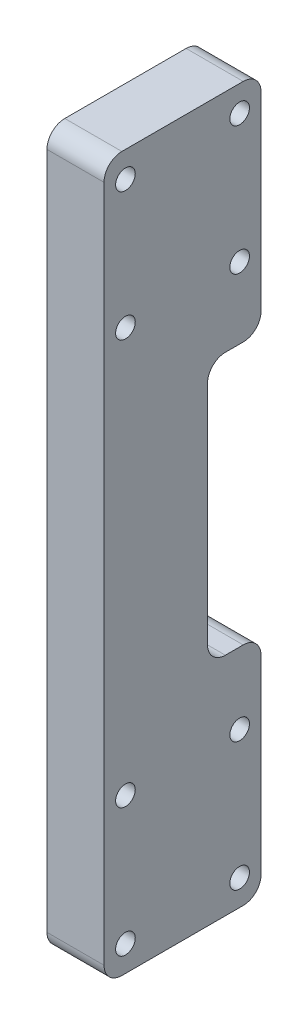
ISO-10303-21;
HEADER;
FILE_DESCRIPTION(('STEP AP214'),'2;1');
FILE_NAME('part.step','',(''),(''),'','','');
FILE_SCHEMA(('AUTOMOTIVE_DESIGN { 1 0 10303 214 1 1 1 1 }'));
ENDSEC;
DATA;
#1=APPLICATION_CONTEXT('core data for automotive mechanical design processes');
#2=APPLICATION_PROTOCOL_DEFINITION('international standard','automotive_design',2000,#1);
#3=PRODUCT_CONTEXT('',#1,'mechanical');
#4=PRODUCT('Part','Part','',(#3));
#5=PRODUCT_RELATED_PRODUCT_CATEGORY('part','',(#4));
#6=PRODUCT_DEFINITION_FORMATION('','',#4);
#7=PRODUCT_DEFINITION_CONTEXT('part definition',#1,'design');
#8=PRODUCT_DEFINITION('design','',#6,#7);
#9=PRODUCT_DEFINITION_SHAPE('','',#8);
#10=(LENGTH_UNIT() NAMED_UNIT(*) SI_UNIT(.MILLI.,.METRE.));
#11=(NAMED_UNIT(*) PLANE_ANGLE_UNIT() SI_UNIT($,.RADIAN.));
#12=(NAMED_UNIT(*) SI_UNIT($,.STERADIAN.) SOLID_ANGLE_UNIT());
#13=UNCERTAINTY_MEASURE_WITH_UNIT(LENGTH_MEASURE(1.E-05),#10,'distance_accuracy_value','');
#14=(GEOMETRIC_REPRESENTATION_CONTEXT(3) GLOBAL_UNCERTAINTY_ASSIGNED_CONTEXT((#13)) GLOBAL_UNIT_ASSIGNED_CONTEXT((#10,
#11,#12)) REPRESENTATION_CONTEXT('',''));
#15=CARTESIAN_POINT('',(0.,0.,0.));
#16=DIRECTION('',(0.,0.,1.));
#17=DIRECTION('',(1.,0.,0.));
#18=AXIS2_PLACEMENT_3D('',#15,#16,#17);
#19=CARTESIAN_POINT('',(16.,-123.946406973508,-52.6620779857653));
#20=DIRECTION('',(1.,0.,0.));
#21=DIRECTION('',(0.,1.,0.));
#22=AXIS2_PLACEMENT_3D('',#19,#20,#21);
#23=PLANE('',#22);
#24=CARTESIAN_POINT('',(16.0000000000006,-216.69640697351,-36.6620779857653));
#25=DIRECTION('',(-1.,0.,0.));
#26=DIRECTION('',(0.,1.,0.));
#27=AXIS2_PLACEMENT_3D('',#24,#25,#26);
#28=CIRCLE('',#27,2.75);
#29=CARTESIAN_POINT('',(16.0000000000006,-219.44640697351,-36.6620779857653));
#30=VERTEX_POINT('',#29);
#31=EDGE_CURVE('E289',#30,#30,#28,.T.);
#32=ORIENTED_EDGE('',*,*,#31,.T.);
#33=EDGE_LOOP('',(#32));
#34=FACE_BOUND('',#33,.T.);
#35=CARTESIAN_POINT('',(16.0000000000006,-216.69640697351,-68.6620779857653));
#36=DIRECTION('',(-1.,0.,0.));
#37=DIRECTION('',(0.,1.,0.));
#38=AXIS2_PLACEMENT_3D('',#35,#36,#37);
#39=CIRCLE('',#38,2.75);
#40=CARTESIAN_POINT('',(16.0000000000007,-219.44640697351,-68.6620779857653));
#41=VERTEX_POINT('',#40);
#42=EDGE_CURVE('E309',#41,#41,#39,.T.);
#43=ORIENTED_EDGE('',*,*,#42,.T.);
#44=EDGE_LOOP('',(#43));
#45=FACE_BOUND('',#44,.T.);
#46=CARTESIAN_POINT('',(16.0000000000004,-180.69640697351,-36.6620779857653));
#47=DIRECTION('',(-1.,0.,0.));
#48=DIRECTION('',(0.,1.,0.));
#49=AXIS2_PLACEMENT_3D('',#46,#47,#48);
#50=CIRCLE('',#49,2.75);
#51=CARTESIAN_POINT('',(16.0000000000004,-183.44640697351,-36.6620779857653));
#52=VERTEX_POINT('',#51);
#53=EDGE_CURVE('E304',#52,#52,#50,.T.);
#54=ORIENTED_EDGE('',*,*,#53,.T.);
#55=EDGE_LOOP('',(#54));
#56=FACE_BOUND('',#55,.T.);
#57=CARTESIAN_POINT('',(16.0000000000004,-180.69640697351,-68.6620779857653));
#58=DIRECTION('',(-1.,0.,0.));
#59=DIRECTION('',(0.,1.,0.));
#60=AXIS2_PLACEMENT_3D('',#57,#58,#59);
#61=CIRCLE('',#60,2.75);
#62=CARTESIAN_POINT('',(16.0000000000004,-183.44640697351,-68.6620779857653));
#63=VERTEX_POINT('',#62);
#64=EDGE_CURVE('E302',#63,#63,#61,.T.);
#65=ORIENTED_EDGE('',*,*,#64,.T.);
#66=EDGE_LOOP('',(#65));
#67=FACE_BOUND('',#66,.T.);
#68=CARTESIAN_POINT('',(15.9999999999996,-67.1964069735096,-36.6620779857653));
#69=DIRECTION('',(-1.,0.,0.));
#70=DIRECTION('',(0.,1.,0.));
#71=AXIS2_PLACEMENT_3D('',#68,#69,#70);
#72=CIRCLE('',#71,2.75);
#73=CARTESIAN_POINT('',(15.9999999999996,-69.9464069735096,-36.6620779857653));
#74=VERTEX_POINT('',#73);
#75=EDGE_CURVE('E298',#74,#74,#72,.T.);
#76=ORIENTED_EDGE('',*,*,#75,.T.);
#77=EDGE_LOOP('',(#76));
#78=FACE_BOUND('',#77,.T.);
#79=CARTESIAN_POINT('',(15.9999999999996,-67.1964069735096,-68.6620779857653));
#80=DIRECTION('',(-1.,0.,0.));
#81=DIRECTION('',(0.,1.,0.));
#82=AXIS2_PLACEMENT_3D('',#79,#80,#81);
#83=CIRCLE('',#82,2.75);
#84=CARTESIAN_POINT('',(15.9999999999997,-69.9464069735096,-68.6620779857653));
#85=VERTEX_POINT('',#84);
#86=EDGE_CURVE('E287',#85,#85,#83,.T.);
#87=ORIENTED_EDGE('',*,*,#86,.T.);
#88=EDGE_LOOP('',(#87));
#89=FACE_BOUND('',#88,.T.);
#90=CARTESIAN_POINT('',(15.9999999999994,-31.1964069735096,-36.6620779857653));
#91=DIRECTION('',(-1.,0.,0.));
#92=DIRECTION('',(0.,1.,0.));
#93=AXIS2_PLACEMENT_3D('',#90,#91,#92);
#94=CIRCLE('',#93,2.75);
#95=CARTESIAN_POINT('',(15.9999999999994,-33.9464069735096,-36.6620779857653));
#96=VERTEX_POINT('',#95);
#97=EDGE_CURVE('E282',#96,#96,#94,.T.);
#98=ORIENTED_EDGE('',*,*,#97,.T.);
#99=EDGE_LOOP('',(#98));
#100=FACE_BOUND('',#99,.T.);
#101=CARTESIAN_POINT('',(15.9999999999994,-31.1964069735096,-68.6620779857653));
#102=DIRECTION('',(-1.,0.,0.));
#103=DIRECTION('',(0.,1.,0.));
#104=AXIS2_PLACEMENT_3D('',#101,#102,#103);
#105=CIRCLE('',#104,2.75);
#106=CARTESIAN_POINT('',(15.9999999999994,-33.9464069735096,-68.6620779857653));
#107=VERTEX_POINT('',#106);
#108=EDGE_CURVE('E228',#107,#107,#105,.T.);
#109=ORIENTED_EDGE('',*,*,#108,.T.);
#110=EDGE_LOOP('',(#109));
#111=FACE_BOUND('',#110,.T.);
#112=CARTESIAN_POINT('',(16.,-28.9464069735079,-35.6620779857653));
#113=DIRECTION('',(-1.,0.,0.));
#114=DIRECTION('',(0.,0.707106781186548,0.707106781186548));
#115=AXIS2_PLACEMENT_3D('',#112,#113,#114);
#116=CIRCLE('',#115,5.);
#117=CARTESIAN_POINT('',(16.,-28.9464069735079,-30.6620779857653));
#118=VERTEX_POINT('',#117);
#119=CARTESIAN_POINT('',(16.,-23.9464069735079,-35.6620779857653));
#120=VERTEX_POINT('',#119);
#121=EDGE_CURVE('E499',#118,#120,#116,.T.);
#122=ORIENTED_EDGE('',*,*,#121,.F.);
#123=DIRECTION('',(0.,-1.,0.));
#124=VECTOR('',#123,1.);
#125=CARTESIAN_POINT('',(16.,-223.946406973508,-30.6620779857653));
#126=LINE('',#125,#124);
#127=CARTESIAN_POINT('',(16.,-218.946406973508,-30.6620779857653));
#128=VERTEX_POINT('',#127);
#129=EDGE_CURVE('E463',#118,#128,#126,.T.);
#130=ORIENTED_EDGE('',*,*,#129,.T.);
#131=CARTESIAN_POINT('',(16.,-218.946406973508,-35.6620779857653));
#132=DIRECTION('',(-1.,0.,0.));
#133=DIRECTION('',(0.,-0.707106781186548,0.707106781186548));
#134=AXIS2_PLACEMENT_3D('',#131,#132,#133);
#135=CIRCLE('',#134,5.);
#136=CARTESIAN_POINT('',(16.,-223.946406973508,-35.6620779857653));
#137=VERTEX_POINT('',#136);
#138=EDGE_CURVE('E271',#137,#128,#135,.T.);
#139=ORIENTED_EDGE('',*,*,#138,.F.);
#140=DIRECTION('',(0.,0.,-1.));
#141=VECTOR('',#140,1.);
#142=CARTESIAN_POINT('',(16.,-223.946406973508,-74.6620779857653));
#143=LINE('',#142,#141);
#144=CARTESIAN_POINT('',(16.,-223.946406973508,-69.6620779857653));
#145=VERTEX_POINT('',#144);
#146=EDGE_CURVE('E262',#137,#145,#143,.T.);
#147=ORIENTED_EDGE('',*,*,#146,.T.);
#148=CARTESIAN_POINT('',(16.,-218.946406973508,-69.6620779857653));
#149=DIRECTION('',(-1.,0.,0.));
#150=DIRECTION('',(0.,-0.707106781186548,-0.707106781186548));
#151=AXIS2_PLACEMENT_3D('',#148,#149,#150);
#152=CIRCLE('',#151,5.);
#153=CARTESIAN_POINT('',(16.,-218.946406973508,-74.6620779857653));
#154=VERTEX_POINT('',#153);
#155=EDGE_CURVE('E223',#154,#145,#152,.T.);
#156=ORIENTED_EDGE('',*,*,#155,.F.);
#157=DIRECTION('',(0.,1.,0.));
#158=VECTOR('',#157,1.);
#159=CARTESIAN_POINT('',(16.,-23.9464069735079,-74.6620779857653));
#160=LINE('',#159,#158);
#161=CARTESIAN_POINT('',(16.,-165.69640697351,-74.6620779857653));
#162=VERTEX_POINT('',#161);
#163=EDGE_CURVE('E217',#154,#162,#160,.T.);
#164=ORIENTED_EDGE('',*,*,#163,.T.);
#165=CARTESIAN_POINT('',(16.0000000000003,-165.69640697351,-69.6620779857653));
#166=DIRECTION('',(-1.,0.,0.));
#167=DIRECTION('',(0.,0.707106781186553,-0.707106781186543));
#168=AXIS2_PLACEMENT_3D('',#165,#166,#167);
#169=CIRCLE('',#168,5.);
#170=CARTESIAN_POINT('',(16.,-160.69640697351,-69.6620779857653));
#171=VERTEX_POINT('',#170);
#172=EDGE_CURVE('E225',#171,#162,#169,.T.);
#173=ORIENTED_EDGE('',*,*,#172,.F.);
#174=DIRECTION('',(0.,0.,1.));
#175=VECTOR('',#174,1.);
#176=CARTESIAN_POINT('',(16.,-160.69640697351,-63.6620779857655));
#177=LINE('',#176,#175);
#178=CARTESIAN_POINT('',(16.,-160.69640697351,-64.6620779857653));
#179=VERTEX_POINT('',#178);
#180=EDGE_CURVE('E253',#171,#179,#177,.T.);
#181=ORIENTED_EDGE('',*,*,#180,.T.);
#182=CARTESIAN_POINT('',(16.,-155.69640697351,-64.6620779857652));
#183=DIRECTION('',(1.,0.,0.));
#184=DIRECTION('',(0.,-0.707106781186558,0.707106781186537));
#185=AXIS2_PLACEMENT_3D('',#182,#183,#184);
#186=CIRCLE('',#185,5.);
#187=CARTESIAN_POINT('',(16.,-155.69640697351,-59.6620779857652));
#188=VERTEX_POINT('',#187);
#189=EDGE_CURVE('E330',#188,#179,#186,.T.);
#190=ORIENTED_EDGE('',*,*,#189,.F.);
#191=DIRECTION('',(0.,1.,0.));
#192=VECTOR('',#191,1.);
#193=CARTESIAN_POINT('',(16.,-142.321406973509,-59.662077985765));
#194=LINE('',#193,#192);
#195=CARTESIAN_POINT('',(16.,-92.1964069735087,-59.6620779857643));
#196=VERTEX_POINT('',#195);
#197=EDGE_CURVE('E352',#188,#196,#194,.T.);
#198=ORIENTED_EDGE('',*,*,#197,.T.);
#199=CARTESIAN_POINT('',(16.,-92.1964069735086,-64.6620779857643));
#200=DIRECTION('',(1.,0.,0.));
#201=DIRECTION('',(0.,0.707106781186537,0.707106781186558));
#202=AXIS2_PLACEMENT_3D('',#199,#200,#201);
#203=CIRCLE('',#202,5.);
#204=CARTESIAN_POINT('',(16.,-87.1964069735086,-64.6620779857642));
#205=VERTEX_POINT('',#204);
#206=EDGE_CURVE('E368',#205,#196,#203,.T.);
#207=ORIENTED_EDGE('',*,*,#206,.F.);
#208=DIRECTION('',(0.,0.,-1.));
#209=VECTOR('',#208,1.);
#210=CARTESIAN_POINT('',(16.,-87.1964069735087,-56.1620779857645));
#211=LINE('',#210,#209);
#212=CARTESIAN_POINT('',(16.,-87.1964069735085,-69.6620779857654));
#213=VERTEX_POINT('',#212);
#214=EDGE_CURVE('E230',#205,#213,#211,.T.);
#215=ORIENTED_EDGE('',*,*,#214,.T.);
#216=CARTESIAN_POINT('',(15.9999999999997,-82.1964069735085,-69.6620779857653));
#217=DIRECTION('',(-1.,0.,0.));
#218=DIRECTION('',(0.,-0.707106781186542,-0.707106781186553));
#219=AXIS2_PLACEMENT_3D('',#216,#217,#218);
#220=CIRCLE('',#219,5.);
#221=CARTESIAN_POINT('',(16.,-82.1964069735085,-74.6620779857653));
#222=VERTEX_POINT('',#221);
#223=EDGE_CURVE('E373',#222,#213,#220,.T.);
#224=ORIENTED_EDGE('',*,*,#223,.F.);
#225=DIRECTION('',(0.,1.,0.));
#226=VECTOR('',#225,1.);
#227=CARTESIAN_POINT('',(16.,-23.9464069735079,-74.6620779857653));
#228=LINE('',#227,#226);
#229=CARTESIAN_POINT('',(16.,-28.9464069735079,-74.6620779857653));
#230=VERTEX_POINT('',#229);
#231=EDGE_CURVE('E381',#222,#230,#228,.T.);
#232=ORIENTED_EDGE('',*,*,#231,.T.);
#233=CARTESIAN_POINT('',(16.,-28.9464069735079,-69.6620779857653));
#234=DIRECTION('',(-1.,0.,0.));
#235=DIRECTION('',(0.,0.707106781186548,-0.707106781186548));
#236=AXIS2_PLACEMENT_3D('',#233,#234,#235);
#237=CIRCLE('',#236,5.);
#238=CARTESIAN_POINT('',(16.,-23.9464069735079,-69.6620779857653));
#239=VERTEX_POINT('',#238);
#240=EDGE_CURVE('E394',#239,#230,#237,.T.);
#241=ORIENTED_EDGE('',*,*,#240,.F.);
#242=DIRECTION('',(0.,0.,1.));
#243=VECTOR('',#242,1.);
#244=CARTESIAN_POINT('',(16.,-23.9464069735079,-30.6620779857653));
#245=LINE('',#244,#243);
#246=EDGE_CURVE('E11',#239,#120,#245,.T.);
#247=ORIENTED_EDGE('',*,*,#246,.T.);
#248=EDGE_LOOP('',(#122,#130,#139,#147,#156,#164,#173,#181,#190,#198,#207,#215,#224,#232,#241,#247));
#249=FACE_BOUND('',#248,.T.);
#250=ADVANCED_FACE('F17',(#34,#45,#56,#67,#78,#89,#100,#111,#249),#23,.T.);
#251=CARTESIAN_POINT('',(0.,-23.9464069735079,-74.6620779857653));
#252=DIRECTION('',(0.,1.,0.));
#253=DIRECTION('',(1.,0.,0.));
#254=AXIS2_PLACEMENT_3D('',#251,#252,#253);
#255=PLANE('',#254);
#256=DIRECTION('',(-1.,0.,0.));
#257=VECTOR('',#256,1.);
#258=CARTESIAN_POINT('',(0.,-23.9464069735079,-35.6620779857653));
#259=LINE('',#258,#257);
#260=CARTESIAN_POINT('',(0.,-23.9464069735079,-35.6620779857653));
#261=VERTEX_POINT('',#260);
#262=EDGE_CURVE('E493',#120,#261,#259,.T.);
#263=ORIENTED_EDGE('',*,*,#262,.F.);
#264=ORIENTED_EDGE('',*,*,#246,.F.);
#265=DIRECTION('',(1.,0.,0.));
#266=VECTOR('',#265,1.);
#267=CARTESIAN_POINT('',(0.,-23.9464069735079,-69.6620779857653));
#268=LINE('',#267,#266);
#269=CARTESIAN_POINT('',(0.,-23.9464069735079,-69.6620779857653));
#270=VERTEX_POINT('',#269);
#271=EDGE_CURVE('E383',#270,#239,#268,.T.);
#272=ORIENTED_EDGE('',*,*,#271,.F.);
#273=DIRECTION('',(0.,0.,-1.));
#274=VECTOR('',#273,1.);
#275=CARTESIAN_POINT('',(0.,-23.9464069735079,-30.6620779857653));
#276=LINE('',#275,#274);
#277=EDGE_CURVE('E459',#261,#270,#276,.T.);
#278=ORIENTED_EDGE('',*,*,#277,.F.);
#279=EDGE_LOOP('',(#263,#264,#272,#278));
#280=FACE_BOUND('',#279,.T.);
#281=ADVANCED_FACE('F540',(#280),#255,.T.);
#282=CARTESIAN_POINT('',(7.2000000000001,-216.69640697351,-36.6620779857653));
#283=DIRECTION('',(-1.,0.,0.));
#284=DIRECTION('',(0.,1.,0.));
#285=AXIS2_PLACEMENT_3D('',#282,#283,#284);
#286=CYLINDRICAL_SURFACE('',#285,2.75);
#287=ORIENTED_EDGE('',*,*,#31,.F.);
#288=DIRECTION('',(-1.,0.,0.));
#289=VECTOR('',#288,1.);
#290=CARTESIAN_POINT('',(7.20000000000012,-219.44640697351,-36.6620779857653));
#291=LINE('',#290,#289);
#292=CARTESIAN_POINT('',(0.,-219.44640697351,-36.6620779857653));
#293=VERTEX_POINT('',#292);
#294=EDGE_CURVE('E30',#30,#293,#291,.T.);
#295=ORIENTED_EDGE('',*,*,#294,.T.);
#296=CARTESIAN_POINT('',(5.93969318174459E-13,-216.69640697351,-36.6620779857653));
#297=DIRECTION('',(1.,0.,0.));
#298=DIRECTION('',(0.,1.,0.));
#299=AXIS2_PLACEMENT_3D('',#296,#297,#298);
#300=CIRCLE('',#299,2.75);
#301=EDGE_CURVE('E416',#293,#293,#300,.T.);
#302=ORIENTED_EDGE('',*,*,#301,.F.);
#303=ORIENTED_EDGE('',*,*,#294,.F.);
#304=EDGE_LOOP('',(#287,#295,#302,#303));
#305=FACE_BOUND('',#304,.T.);
#306=ADVANCED_FACE('F604',(#305),#286,.F.);
#307=CARTESIAN_POINT('',(7.2000000000001,-216.69640697351,-68.6620779857653));
#308=DIRECTION('',(-1.,0.,0.));
#309=DIRECTION('',(0.,1.,0.));
#310=AXIS2_PLACEMENT_3D('',#307,#308,#309);
#311=CYLINDRICAL_SURFACE('',#310,2.75);
#312=ORIENTED_EDGE('',*,*,#42,.F.);
#313=DIRECTION('',(-1.,0.,0.));
#314=VECTOR('',#313,1.);
#315=CARTESIAN_POINT('',(7.20000000000012,-219.44640697351,-68.6620779857653));
#316=LINE('',#315,#314);
#317=CARTESIAN_POINT('',(0.,-219.44640697351,-68.6620779857653));
#318=VERTEX_POINT('',#317);
#319=EDGE_CURVE('E20',#41,#318,#316,.T.);
#320=ORIENTED_EDGE('',*,*,#319,.T.);
#321=CARTESIAN_POINT('',(6.33937347060964E-13,-216.69640697351,-68.6620779857653));
#322=DIRECTION('',(1.,0.,0.));
#323=DIRECTION('',(0.,1.,0.));
#324=AXIS2_PLACEMENT_3D('',#321,#322,#323);
#325=CIRCLE('',#324,2.75);
#326=EDGE_CURVE('E412',#318,#318,#325,.T.);
#327=ORIENTED_EDGE('',*,*,#326,.F.);
#328=ORIENTED_EDGE('',*,*,#319,.F.);
#329=EDGE_LOOP('',(#312,#320,#327,#328));
#330=FACE_BOUND('',#329,.T.);
#331=ADVANCED_FACE('F643',(#330),#311,.F.);
#332=CARTESIAN_POINT('',(7.2000000000001,-180.69640697351,-36.6620779857653));
#333=DIRECTION('',(-1.,0.,0.));
#334=DIRECTION('',(0.,1.,0.));
#335=AXIS2_PLACEMENT_3D('',#332,#333,#334);
#336=CYLINDRICAL_SURFACE('',#335,2.75);
#337=ORIENTED_EDGE('',*,*,#53,.F.);
#338=DIRECTION('',(-1.,0.,0.));
#339=VECTOR('',#338,1.);
#340=CARTESIAN_POINT('',(7.20000000000012,-183.44640697351,-36.6620779857653));
#341=LINE('',#340,#339);
#342=CARTESIAN_POINT('',(0.,-183.44640697351,-36.6620779857653));
#343=VERTEX_POINT('',#342);
#344=EDGE_CURVE('E306',#52,#343,#341,.T.);
#345=ORIENTED_EDGE('',*,*,#344,.T.);
#346=CARTESIAN_POINT('',(3.5527136788005E-13,-180.69640697351,-36.6620779857653));
#347=DIRECTION('',(1.,0.,0.));
#348=DIRECTION('',(0.,1.,0.));
#349=AXIS2_PLACEMENT_3D('',#346,#347,#348);
#350=CIRCLE('',#349,2.75);
#351=EDGE_CURVE('E411',#343,#343,#350,.T.);
#352=ORIENTED_EDGE('',*,*,#351,.F.);
#353=ORIENTED_EDGE('',*,*,#344,.F.);
#354=EDGE_LOOP('',(#337,#345,#352,#353));
#355=FACE_BOUND('',#354,.T.);
#356=ADVANCED_FACE('F634',(#355),#336,.F.);
#357=CARTESIAN_POINT('',(7.2000000000001,-180.69640697351,-68.6620779857653));
#358=DIRECTION('',(-1.,0.,0.));
#359=DIRECTION('',(0.,1.,0.));
#360=AXIS2_PLACEMENT_3D('',#357,#358,#359);
#361=CYLINDRICAL_SURFACE('',#360,2.75);
#362=ORIENTED_EDGE('',*,*,#64,.F.);
#363=DIRECTION('',(-1.,0.,0.));
#364=VECTOR('',#363,1.);
#365=CARTESIAN_POINT('',(7.20000000000012,-183.44640697351,-68.6620779857653));
#366=LINE('',#365,#364);
#367=CARTESIAN_POINT('',(0.,-183.44640697351,-68.6620779857653));
#368=VERTEX_POINT('',#367);
#369=EDGE_CURVE('E167',#63,#368,#366,.T.);
#370=ORIENTED_EDGE('',*,*,#369,.T.);
#371=CARTESIAN_POINT('',(3.95239396766556E-13,-180.69640697351,-68.6620779857653));
#372=DIRECTION('',(1.,0.,0.));
#373=DIRECTION('',(0.,1.,0.));
#374=AXIS2_PLACEMENT_3D('',#371,#372,#373);
#375=CIRCLE('',#374,2.75);
#376=EDGE_CURVE('E410',#368,#368,#375,.T.);
#377=ORIENTED_EDGE('',*,*,#376,.F.);
#378=ORIENTED_EDGE('',*,*,#369,.F.);
#379=EDGE_LOOP('',(#362,#370,#377,#378));
#380=FACE_BOUND('',#379,.T.);
#381=ADVANCED_FACE('F515',(#380),#361,.F.);
#382=CARTESIAN_POINT('',(7.2000000000001,-67.1964069735097,-36.6620779857653));
#383=DIRECTION('',(-1.,0.,0.));
#384=DIRECTION('',(0.,1.,0.));
#385=AXIS2_PLACEMENT_3D('',#382,#383,#384);
#386=CYLINDRICAL_SURFACE('',#385,2.75);
#387=ORIENTED_EDGE('',*,*,#75,.F.);
#388=DIRECTION('',(-1.,0.,0.));
#389=VECTOR('',#388,1.);
#390=CARTESIAN_POINT('',(7.20000000000012,-69.9464069735097,-36.6620779857653));
#391=LINE('',#390,#389);
#392=CARTESIAN_POINT('',(0.,-69.9464069735097,-36.6620779857653));
#393=VERTEX_POINT('',#392);
#394=EDGE_CURVE('E154',#74,#393,#391,.T.);
#395=ORIENTED_EDGE('',*,*,#394,.T.);
#396=CARTESIAN_POINT('',(-3.95239396766556E-13,-67.1964069735097,-36.6620779857653));
#397=DIRECTION('',(1.,0.,0.));
#398=DIRECTION('',(0.,1.,0.));
#399=AXIS2_PLACEMENT_3D('',#396,#397,#398);
#400=CIRCLE('',#399,2.75);
#401=EDGE_CURVE('E406',#393,#393,#400,.T.);
#402=ORIENTED_EDGE('',*,*,#401,.F.);
#403=ORIENTED_EDGE('',*,*,#394,.F.);
#404=EDGE_LOOP('',(#387,#395,#402,#403));
#405=FACE_BOUND('',#404,.T.);
#406=ADVANCED_FACE('F623',(#405),#386,.F.);
#407=CARTESIAN_POINT('',(7.2000000000001,-67.1964069735097,-68.6620779857653));
#408=DIRECTION('',(-1.,0.,0.));
#409=DIRECTION('',(0.,1.,0.));
#410=AXIS2_PLACEMENT_3D('',#407,#408,#409);
#411=CYLINDRICAL_SURFACE('',#410,2.75);
#412=ORIENTED_EDGE('',*,*,#86,.F.);
#413=DIRECTION('',(-1.,0.,0.));
#414=VECTOR('',#413,1.);
#415=CARTESIAN_POINT('',(7.20000000000012,-69.9464069735097,-68.6620779857653));
#416=LINE('',#415,#414);
#417=CARTESIAN_POINT('',(0.,-69.9464069735097,-68.6620779857653));
#418=VERTEX_POINT('',#417);
#419=EDGE_CURVE('E294',#85,#418,#416,.T.);
#420=ORIENTED_EDGE('',*,*,#419,.T.);
#421=CARTESIAN_POINT('',(-3.5527136788005E-13,-67.1964069735097,-68.6620779857653));
#422=DIRECTION('',(1.,0.,0.));
#423=DIRECTION('',(0.,1.,0.));
#424=AXIS2_PLACEMENT_3D('',#421,#422,#423);
#425=CIRCLE('',#424,2.75);
#426=EDGE_CURVE('E401',#418,#418,#425,.T.);
#427=ORIENTED_EDGE('',*,*,#426,.F.);
#428=ORIENTED_EDGE('',*,*,#419,.F.);
#429=EDGE_LOOP('',(#412,#420,#427,#428));
#430=FACE_BOUND('',#429,.T.);
#431=ADVANCED_FACE('F624',(#430),#411,.F.);
#432=CARTESIAN_POINT('',(7.2000000000001,-31.1964069735096,-36.6620779857653));
#433=DIRECTION('',(-1.,0.,0.));
#434=DIRECTION('',(0.,1.,0.));
#435=AXIS2_PLACEMENT_3D('',#432,#433,#434);
#436=CYLINDRICAL_SURFACE('',#435,2.75);
#437=ORIENTED_EDGE('',*,*,#97,.F.);
#438=DIRECTION('',(-1.,0.,0.));
#439=VECTOR('',#438,1.);
#440=CARTESIAN_POINT('',(7.20000000000012,-33.9464069735096,-36.6620779857653));
#441=LINE('',#440,#439);
#442=CARTESIAN_POINT('',(0.,-33.9464069735097,-36.6620779857653));
#443=VERTEX_POINT('',#442);
#444=EDGE_CURVE('E286',#96,#443,#441,.T.);
#445=ORIENTED_EDGE('',*,*,#444,.T.);
#446=CARTESIAN_POINT('',(-6.33937347060964E-13,-31.1964069735097,-36.6620779857653));
#447=DIRECTION('',(1.,0.,0.));
#448=DIRECTION('',(0.,1.,0.));
#449=AXIS2_PLACEMENT_3D('',#446,#447,#448);
#450=CIRCLE('',#449,2.75);
#451=EDGE_CURVE('E405',#443,#443,#450,.T.);
#452=ORIENTED_EDGE('',*,*,#451,.F.);
#453=ORIENTED_EDGE('',*,*,#444,.F.);
#454=EDGE_LOOP('',(#437,#445,#452,#453));
#455=FACE_BOUND('',#454,.T.);
#456=ADVANCED_FACE('F635',(#455),#436,.F.);
#457=CARTESIAN_POINT('',(7.2000000000001,-31.1964069735096,-68.6620779857653));
#458=DIRECTION('',(-1.,0.,0.));
#459=DIRECTION('',(0.,1.,0.));
#460=AXIS2_PLACEMENT_3D('',#457,#458,#459);
#461=CYLINDRICAL_SURFACE('',#460,2.75);
#462=ORIENTED_EDGE('',*,*,#108,.F.);
#463=DIRECTION('',(-1.,0.,0.));
#464=VECTOR('',#463,1.);
#465=CARTESIAN_POINT('',(7.20000000000012,-33.9464069735096,-68.6620779857653));
#466=LINE('',#465,#464);
#467=CARTESIAN_POINT('',(0.,-33.9464069735097,-68.6620779857653));
#468=VERTEX_POINT('',#467);
#469=EDGE_CURVE('E276',#107,#468,#466,.T.);
#470=ORIENTED_EDGE('',*,*,#469,.T.);
#471=CARTESIAN_POINT('',(-5.93969318174459E-13,-31.1964069735097,-68.6620779857653));
#472=DIRECTION('',(1.,0.,0.));
#473=DIRECTION('',(0.,1.,0.));
#474=AXIS2_PLACEMENT_3D('',#471,#472,#473);
#475=CIRCLE('',#474,2.75);
#476=EDGE_CURVE('E400',#468,#468,#475,.T.);
#477=ORIENTED_EDGE('',*,*,#476,.F.);
#478=ORIENTED_EDGE('',*,*,#469,.F.);
#479=EDGE_LOOP('',(#462,#470,#477,#478));
#480=FACE_BOUND('',#479,.T.);
#481=ADVANCED_FACE('F616',(#480),#461,.F.);
#482=CARTESIAN_POINT('',(0.,-223.946406973508,-74.6620779857653));
#483=DIRECTION('',(0.,0.,-1.));
#484=DIRECTION('',(0.,-1.,0.));
#485=AXIS2_PLACEMENT_3D('',#482,#483,#484);
#486=PLANE('',#485);
#487=DIRECTION('',(-1.,0.,0.));
#488=VECTOR('',#487,1.);
#489=CARTESIAN_POINT('',(7.99999999999979,-165.69640697351,-74.6620779857653));
#490=LINE('',#489,#488);
#491=CARTESIAN_POINT('',(0.,-165.69640697351,-74.6620779857653));
#492=VERTEX_POINT('',#491);
#493=EDGE_CURVE('E233',#162,#492,#490,.T.);
#494=ORIENTED_EDGE('',*,*,#493,.F.);
#495=ORIENTED_EDGE('',*,*,#163,.F.);
#496=DIRECTION('',(1.,0.,0.));
#497=VECTOR('',#496,1.);
#498=CARTESIAN_POINT('',(0.,-218.946406973508,-74.6620779857653));
#499=LINE('',#498,#497);
#500=CARTESIAN_POINT('',(0.,-218.946406973508,-74.6620779857653));
#501=VERTEX_POINT('',#500);
#502=EDGE_CURVE('E261',#501,#154,#499,.T.);
#503=ORIENTED_EDGE('',*,*,#502,.F.);
#504=DIRECTION('',(0.,-1.,0.));
#505=VECTOR('',#504,1.);
#506=CARTESIAN_POINT('',(0.,-23.9464069735079,-74.6620779857653));
#507=LINE('',#506,#505);
#508=EDGE_CURVE('E240',#492,#501,#507,.T.);
#509=ORIENTED_EDGE('',*,*,#508,.F.);
#510=EDGE_LOOP('',(#494,#495,#503,#509));
#511=FACE_BOUND('',#510,.T.);
#512=ADVANCED_FACE('F232',(#511),#486,.T.);
#513=CARTESIAN_POINT('',(15.9999999999994,-87.1964069735087,-59.6620779857642));
#514=DIRECTION('',(0.,1.,0.));
#515=DIRECTION('',(0.,0.,-1.));
#516=AXIS2_PLACEMENT_3D('',#513,#514,#515);
#517=PLANE('',#516);
#518=DIRECTION('',(-1.,0.,0.));
#519=VECTOR('',#518,1.);
#520=CARTESIAN_POINT('',(7.99999999999928,-87.1964069735086,-69.6620779857654));
#521=LINE('',#520,#519);
#522=CARTESIAN_POINT('',(0.,-87.1964069735086,-69.6620779857654));
#523=VERTEX_POINT('',#522);
#524=EDGE_CURVE('E367',#213,#523,#521,.T.);
#525=ORIENTED_EDGE('',*,*,#524,.F.);
#526=ORIENTED_EDGE('',*,*,#214,.F.);
#527=DIRECTION('',(1.,0.,0.));
#528=VECTOR('',#527,1.);
#529=CARTESIAN_POINT('',(15.9999999999994,-87.1964069735086,-64.6620779857642));
#530=LINE('',#529,#528);
#531=CARTESIAN_POINT('',(0.,-87.1964069735087,-64.6620779857642));
#532=VERTEX_POINT('',#531);
#533=EDGE_CURVE('E360',#532,#205,#530,.T.);
#534=ORIENTED_EDGE('',*,*,#533,.F.);
#535=DIRECTION('',(0.,0.,1.));
#536=VECTOR('',#535,1.);
#537=CARTESIAN_POINT('',(0.,-87.1964069735088,-56.1620779857645));
#538=LINE('',#537,#536);
#539=EDGE_CURVE('E449',#523,#532,#538,.T.);
#540=ORIENTED_EDGE('',*,*,#539,.F.);
#541=EDGE_LOOP('',(#525,#526,#534,#540));
#542=FACE_BOUND('',#541,.T.);
#543=ADVANCED_FACE('F562',(#542),#517,.F.);
#544=CARTESIAN_POINT('',(0.,-218.946406973508,-35.6620779857653));
#545=DIRECTION('',(1.,0.,0.));
#546=DIRECTION('',(0.,-0.707106781186548,0.707106781186548));
#547=AXIS2_PLACEMENT_3D('',#544,#545,#546);
#548=CYLINDRICAL_SURFACE('',#547,5.);
#549=ORIENTED_EDGE('',*,*,#138,.T.);
#550=DIRECTION('',(-1.,0.,0.));
#551=VECTOR('',#550,1.);
#552=CARTESIAN_POINT('',(0.,-218.946406973508,-30.6620779857653));
#553=LINE('',#552,#551);
#554=CARTESIAN_POINT('',(0.,-218.946406973508,-30.6620779857653));
#555=VERTEX_POINT('',#554);
#556=EDGE_CURVE('E468',#128,#555,#553,.T.);
#557=ORIENTED_EDGE('',*,*,#556,.T.);
#558=CARTESIAN_POINT('',(0.,-218.946406973508,-35.6620779857653));
#559=DIRECTION('',(1.,0.,0.));
#560=DIRECTION('',(0.,-0.707106781186548,0.707106781186548));
#561=AXIS2_PLACEMENT_3D('',#558,#559,#560);
#562=CIRCLE('',#561,5.);
#563=CARTESIAN_POINT('',(0.,-223.946406973508,-35.6620779857653));
#564=VERTEX_POINT('',#563);
#565=EDGE_CURVE('E425',#555,#564,#562,.T.);
#566=ORIENTED_EDGE('',*,*,#565,.T.);
#567=DIRECTION('',(1.,0.,0.));
#568=VECTOR('',#567,1.);
#569=CARTESIAN_POINT('',(0.,-223.946406973508,-35.6620779857653));
#570=LINE('',#569,#568);
#571=EDGE_CURVE('E270',#564,#137,#570,.T.);
#572=ORIENTED_EDGE('',*,*,#571,.T.);
#573=EDGE_LOOP('',(#549,#557,#566,#572));
#574=FACE_BOUND('',#573,.T.);
#575=ADVANCED_FACE('F584',(#574),#548,.T.);
#576=CARTESIAN_POINT('',(0.,-223.946406973508,-30.6620779857653));
#577=DIRECTION('',(0.,-1.,0.));
#578=DIRECTION('',(0.,0.,-1.));
#579=AXIS2_PLACEMENT_3D('',#576,#577,#578);
#580=PLANE('',#579);
#581=DIRECTION('',(-1.,0.,0.));
#582=VECTOR('',#581,1.);
#583=CARTESIAN_POINT('',(0.,-223.946406973508,-69.6620779857653));
#584=LINE('',#583,#582);
#585=CARTESIAN_POINT('',(0.,-223.946406973508,-69.6620779857653));
#586=VERTEX_POINT('',#585);
#587=EDGE_CURVE('E260',#145,#586,#584,.T.);
#588=ORIENTED_EDGE('',*,*,#587,.F.);
#589=ORIENTED_EDGE('',*,*,#146,.F.);
#590=ORIENTED_EDGE('',*,*,#571,.F.);
#591=DIRECTION('',(0.,0.,1.));
#592=VECTOR('',#591,1.);
#593=CARTESIAN_POINT('',(0.,-223.946406973508,-74.6620779857653));
#594=LINE('',#593,#592);
#595=EDGE_CURVE('E426',#586,#564,#594,.T.);
#596=ORIENTED_EDGE('',*,*,#595,.F.);
#597=EDGE_LOOP('',(#588,#589,#590,#596));
#598=FACE_BOUND('',#597,.T.);
#599=ADVANCED_FACE('F581',(#598),#580,.T.);
#600=CARTESIAN_POINT('',(0.,-218.946406973508,-69.6620779857653));
#601=DIRECTION('',(1.,0.,0.));
#602=DIRECTION('',(0.,-0.707106781186548,-0.707106781186548));
#603=AXIS2_PLACEMENT_3D('',#600,#601,#602);
#604=CYLINDRICAL_SURFACE('',#603,5.);
#605=ORIENTED_EDGE('',*,*,#155,.T.);
#606=ORIENTED_EDGE('',*,*,#587,.T.);
#607=CARTESIAN_POINT('',(0.,-218.946406973508,-69.6620779857653));
#608=DIRECTION('',(1.,0.,0.));
#609=DIRECTION('',(0.,-0.707106781186548,-0.707106781186548));
#610=AXIS2_PLACEMENT_3D('',#607,#608,#609);
#611=CIRCLE('',#610,5.);
#612=EDGE_CURVE('E429',#586,#501,#611,.T.);
#613=ORIENTED_EDGE('',*,*,#612,.T.);
#614=ORIENTED_EDGE('',*,*,#502,.T.);
#615=EDGE_LOOP('',(#605,#606,#613,#614));
#616=FACE_BOUND('',#615,.T.);
#617=ADVANCED_FACE('F577',(#616),#604,.T.);
#618=CARTESIAN_POINT('',(7.99999999999979,-165.69640697351,-69.6620779857653));
#619=DIRECTION('',(1.,0.,0.));
#620=DIRECTION('',(0.,0.707106781186553,-0.707106781186543));
#621=AXIS2_PLACEMENT_3D('',#618,#619,#620);
#622=CYLINDRICAL_SURFACE('',#621,5.);
#623=ORIENTED_EDGE('',*,*,#172,.T.);
#624=ORIENTED_EDGE('',*,*,#493,.T.);
#625=CARTESIAN_POINT('',(2.53130849614536E-13,-165.69640697351,-69.6620779857653));
#626=DIRECTION('',(1.,0.,0.));
#627=DIRECTION('',(0.,0.707106781186553,-0.707106781186543));
#628=AXIS2_PLACEMENT_3D('',#625,#626,#627);
#629=CIRCLE('',#628,5.);
#630=CARTESIAN_POINT('',(0.,-160.69640697351,-69.6620779857653));
#631=VERTEX_POINT('',#630);
#632=EDGE_CURVE('E436',#492,#631,#629,.T.);
#633=ORIENTED_EDGE('',*,*,#632,.T.);
#634=DIRECTION('',(1.,0.,0.));
#635=VECTOR('',#634,1.);
#636=CARTESIAN_POINT('',(7.99999999999976,-160.69640697351,-69.6620779857653));
#637=LINE('',#636,#635);
#638=EDGE_CURVE('E242',#631,#171,#637,.T.);
#639=ORIENTED_EDGE('',*,*,#638,.T.);
#640=EDGE_LOOP('',(#623,#624,#633,#639));
#641=FACE_BOUND('',#640,.T.);
#642=ADVANCED_FACE('F245',(#641),#622,.T.);
#643=CARTESIAN_POINT('',(16.,-160.69640697351,-74.6620779857653));
#644=DIRECTION('',(0.,-1.,0.));
#645=DIRECTION('',(0.,0.,-1.));
#646=AXIS2_PLACEMENT_3D('',#643,#644,#645);
#647=PLANE('',#646);
#648=DIRECTION('',(-1.,0.,0.));
#649=VECTOR('',#648,1.);
#650=CARTESIAN_POINT('',(16.,-160.69640697351,-64.6620779857653));
#651=LINE('',#650,#649);
#652=CARTESIAN_POINT('',(0.,-160.69640697351,-64.6620779857653));
#653=VERTEX_POINT('',#652);
#654=EDGE_CURVE('E328',#179,#653,#651,.T.);
#655=ORIENTED_EDGE('',*,*,#654,.F.);
#656=ORIENTED_EDGE('',*,*,#180,.F.);
#657=ORIENTED_EDGE('',*,*,#638,.F.);
#658=DIRECTION('',(0.,0.,-1.));
#659=VECTOR('',#658,1.);
#660=CARTESIAN_POINT('',(0.,-160.69640697351,-63.6620779857655));
#661=LINE('',#660,#659);
#662=EDGE_CURVE('E345',#653,#631,#661,.T.);
#663=ORIENTED_EDGE('',*,*,#662,.F.);
#664=EDGE_LOOP('',(#655,#656,#657,#663));
#665=FACE_BOUND('',#664,.T.);
#666=ADVANCED_FACE('F340',(#665),#647,.F.);
#667=CARTESIAN_POINT('',(16.,-155.69640697351,-64.6620779857652));
#668=DIRECTION('',(-1.,0.,0.));
#669=DIRECTION('',(0.,-0.707106781186558,0.707106781186537));
#670=AXIS2_PLACEMENT_3D('',#667,#668,#669);
#671=CYLINDRICAL_SURFACE('',#670,5.);
#672=ORIENTED_EDGE('',*,*,#189,.T.);
#673=ORIENTED_EDGE('',*,*,#654,.T.);
#674=CARTESIAN_POINT('',(2.1094237467878E-13,-155.69640697351,-64.6620779857652));
#675=DIRECTION('',(-1.,0.,0.));
#676=DIRECTION('',(0.,-0.707106781186558,0.707106781186537));
#677=AXIS2_PLACEMENT_3D('',#674,#675,#676);
#678=CIRCLE('',#677,5.);
#679=CARTESIAN_POINT('',(0.,-155.696406973511,-59.6620779857652));
#680=VERTEX_POINT('',#679);
#681=EDGE_CURVE('E444',#653,#680,#678,.T.);
#682=ORIENTED_EDGE('',*,*,#681,.T.);
#683=DIRECTION('',(1.,0.,0.));
#684=VECTOR('',#683,1.);
#685=CARTESIAN_POINT('',(16.,-155.69640697351,-59.6620779857652));
#686=LINE('',#685,#684);
#687=EDGE_CURVE('E346',#680,#188,#686,.T.);
#688=ORIENTED_EDGE('',*,*,#687,.T.);
#689=EDGE_LOOP('',(#672,#673,#682,#688));
#690=FACE_BOUND('',#689,.T.);
#691=ADVANCED_FACE('F350',(#690),#671,.F.);
#692=CARTESIAN_POINT('',(16.,-160.69640697351,-59.6620779857653));
#693=DIRECTION('',(0.,0.,1.));
#694=DIRECTION('',(0.,-1.,0.));
#695=AXIS2_PLACEMENT_3D('',#692,#693,#694);
#696=PLANE('',#695);
#697=DIRECTION('',(-1.,0.,0.));
#698=VECTOR('',#697,1.);
#699=CARTESIAN_POINT('',(15.9999999999994,-92.1964069735087,-59.6620779857643));
#700=LINE('',#699,#698);
#701=CARTESIAN_POINT('',(0.,-92.1964069735088,-59.6620779857643));
#702=VERTEX_POINT('',#701);
#703=EDGE_CURVE('E361',#196,#702,#700,.T.);
#704=ORIENTED_EDGE('',*,*,#703,.F.);
#705=ORIENTED_EDGE('',*,*,#197,.F.);
#706=ORIENTED_EDGE('',*,*,#687,.F.);
#707=DIRECTION('',(0.,-1.,0.));
#708=VECTOR('',#707,1.);
#709=CARTESIAN_POINT('',(0.,-142.321406973509,-59.662077985765));
#710=LINE('',#709,#708);
#711=EDGE_CURVE('E438',#702,#680,#710,.T.);
#712=ORIENTED_EDGE('',*,*,#711,.F.);
#713=EDGE_LOOP('',(#704,#705,#706,#712));
#714=FACE_BOUND('',#713,.T.);
#715=ADVANCED_FACE('F575',(#714),#696,.F.);
#716=CARTESIAN_POINT('',(15.9999999999994,-92.1964069735086,-64.6620779857643));
#717=DIRECTION('',(-1.,0.,0.));
#718=DIRECTION('',(0.,0.707106781186537,0.707106781186558));
#719=AXIS2_PLACEMENT_3D('',#716,#717,#718);
#720=CYLINDRICAL_SURFACE('',#719,5.);
#721=ORIENTED_EDGE('',*,*,#206,.T.);
#722=ORIENTED_EDGE('',*,*,#703,.T.);
#723=CARTESIAN_POINT('',(-1.75415237890775E-13,-92.1964069735087,-64.6620779857643));
#724=DIRECTION('',(-1.,0.,0.));
#725=DIRECTION('',(0.,0.707106781186537,0.707106781186558));
#726=AXIS2_PLACEMENT_3D('',#723,#724,#725);
#727=CIRCLE('',#726,5.);
#728=EDGE_CURVE('E441',#702,#532,#727,.T.);
#729=ORIENTED_EDGE('',*,*,#728,.T.);
#730=ORIENTED_EDGE('',*,*,#533,.T.);
#731=EDGE_LOOP('',(#721,#722,#729,#730));
#732=FACE_BOUND('',#731,.T.);
#733=ADVANCED_FACE('F568',(#732),#720,.F.);
#734=CARTESIAN_POINT('',(7.99999999999925,-82.1964069735085,-69.6620779857653));
#735=DIRECTION('',(-1.,0.,0.));
#736=DIRECTION('',(0.,-0.707106781186542,-0.707106781186553));
#737=AXIS2_PLACEMENT_3D('',#734,#735,#736);
#738=CYLINDRICAL_SURFACE('',#737,5.);
#739=CARTESIAN_POINT('',(-2.53130849614536E-13,-82.1964069735086,-69.6620779857653));
#740=DIRECTION('',(1.,0.,0.));
#741=DIRECTION('',(0.,-0.707106781186542,-0.707106781186553));
#742=AXIS2_PLACEMENT_3D('',#739,#740,#741);
#743=CIRCLE('',#742,5.);
#744=CARTESIAN_POINT('',(0.,-82.1964069735086,-74.6620779857653));
#745=VERTEX_POINT('',#744);
#746=EDGE_CURVE('E455',#523,#745,#743,.T.);
#747=ORIENTED_EDGE('',*,*,#746,.T.);
#748=DIRECTION('',(1.,0.,0.));
#749=VECTOR('',#748,1.);
#750=CARTESIAN_POINT('',(7.99999999999925,-82.1964069735085,-74.6620779857653));
#751=LINE('',#750,#749);
#752=EDGE_CURVE('E380',#745,#222,#751,.T.);
#753=ORIENTED_EDGE('',*,*,#752,.T.);
#754=ORIENTED_EDGE('',*,*,#223,.T.);
#755=ORIENTED_EDGE('',*,*,#524,.T.);
#756=EDGE_LOOP('',(#747,#753,#754,#755));
#757=FACE_BOUND('',#756,.T.);
#758=ADVANCED_FACE('F560',(#757),#738,.T.);
#759=CARTESIAN_POINT('',(0.,-223.946406973508,-74.6620779857653));
#760=DIRECTION('',(0.,0.,-1.));
#761=DIRECTION('',(0.,-1.,0.));
#762=AXIS2_PLACEMENT_3D('',#759,#760,#761);
#763=PLANE('',#762);
#764=DIRECTION('',(-1.,0.,0.));
#765=VECTOR('',#764,1.);
#766=CARTESIAN_POINT('',(0.,-28.9464069735079,-74.6620779857653));
#767=LINE('',#766,#765);
#768=CARTESIAN_POINT('',(0.,-28.9464069735079,-74.6620779857653));
#769=VERTEX_POINT('',#768);
#770=EDGE_CURVE('E388',#230,#769,#767,.T.);
#771=ORIENTED_EDGE('',*,*,#770,.F.);
#772=ORIENTED_EDGE('',*,*,#231,.F.);
#773=ORIENTED_EDGE('',*,*,#752,.F.);
#774=DIRECTION('',(0.,-1.,0.));
#775=VECTOR('',#774,1.);
#776=CARTESIAN_POINT('',(0.,-23.9464069735079,-74.6620779857653));
#777=LINE('',#776,#775);
#778=EDGE_CURVE('E457',#769,#745,#777,.T.);
#779=ORIENTED_EDGE('',*,*,#778,.F.);
#780=EDGE_LOOP('',(#771,#772,#773,#779));
#781=FACE_BOUND('',#780,.T.);
#782=ADVANCED_FACE('F557',(#781),#763,.T.);
#783=CARTESIAN_POINT('',(0.,-28.9464069735079,-69.6620779857653));
#784=DIRECTION('',(1.,0.,0.));
#785=DIRECTION('',(0.,0.707106781186548,-0.707106781186548));
#786=AXIS2_PLACEMENT_3D('',#783,#784,#785);
#787=CYLINDRICAL_SURFACE('',#786,5.);
#788=ORIENTED_EDGE('',*,*,#240,.T.);
#789=ORIENTED_EDGE('',*,*,#770,.T.);
#790=CARTESIAN_POINT('',(0.,-28.9464069735079,-69.6620779857653));
#791=DIRECTION('',(1.,0.,0.));
#792=DIRECTION('',(0.,0.707106781186548,-0.707106781186548));
#793=AXIS2_PLACEMENT_3D('',#790,#791,#792);
#794=CIRCLE('',#793,5.);
#795=EDGE_CURVE('E454',#769,#270,#794,.T.);
#796=ORIENTED_EDGE('',*,*,#795,.T.);
#797=ORIENTED_EDGE('',*,*,#271,.T.);
#798=EDGE_LOOP('',(#788,#789,#796,#797));
#799=FACE_BOUND('',#798,.T.);
#800=ADVANCED_FACE('F520',(#799),#787,.T.);
#801=CARTESIAN_POINT('',(0.,-123.946406973508,-52.6620779857653));
#802=DIRECTION('',(1.,0.,0.));
#803=DIRECTION('',(0.,1.,0.));
#804=AXIS2_PLACEMENT_3D('',#801,#802,#803);
#805=PLANE('',#804);
#806=ORIENTED_EDGE('',*,*,#476,.T.);
#807=EDGE_LOOP('',(#806));
#808=FACE_BOUND('',#807,.T.);
#809=ORIENTED_EDGE('',*,*,#451,.T.);
#810=EDGE_LOOP('',(#809));
#811=FACE_BOUND('',#810,.T.);
#812=ORIENTED_EDGE('',*,*,#426,.T.);
#813=EDGE_LOOP('',(#812));
#814=FACE_BOUND('',#813,.T.);
#815=ORIENTED_EDGE('',*,*,#401,.T.);
#816=EDGE_LOOP('',(#815));
#817=FACE_BOUND('',#816,.T.);
#818=ORIENTED_EDGE('',*,*,#376,.T.);
#819=EDGE_LOOP('',(#818));
#820=FACE_BOUND('',#819,.T.);
#821=ORIENTED_EDGE('',*,*,#351,.T.);
#822=EDGE_LOOP('',(#821));
#823=FACE_BOUND('',#822,.T.);
#824=ORIENTED_EDGE('',*,*,#326,.T.);
#825=EDGE_LOOP('',(#824));
#826=FACE_BOUND('',#825,.T.);
#827=ORIENTED_EDGE('',*,*,#301,.T.);
#828=EDGE_LOOP('',(#827));
#829=FACE_BOUND('',#828,.T.);
#830=CARTESIAN_POINT('',(0.,-28.9464069735079,-35.6620779857653));
#831=DIRECTION('',(1.,0.,0.));
#832=DIRECTION('',(0.,0.707106781186548,0.707106781186548));
#833=AXIS2_PLACEMENT_3D('',#830,#831,#832);
#834=CIRCLE('',#833,5.);
#835=CARTESIAN_POINT('',(0.,-28.9464069735079,-30.6620779857653));
#836=VERTEX_POINT('',#835);
#837=EDGE_CURVE('E488',#261,#836,#834,.T.);
#838=ORIENTED_EDGE('',*,*,#837,.F.);
#839=ORIENTED_EDGE('',*,*,#277,.T.);
#840=ORIENTED_EDGE('',*,*,#795,.F.);
#841=ORIENTED_EDGE('',*,*,#778,.T.);
#842=ORIENTED_EDGE('',*,*,#746,.F.);
#843=ORIENTED_EDGE('',*,*,#539,.T.);
#844=ORIENTED_EDGE('',*,*,#728,.F.);
#845=ORIENTED_EDGE('',*,*,#711,.T.);
#846=ORIENTED_EDGE('',*,*,#681,.F.);
#847=ORIENTED_EDGE('',*,*,#662,.T.);
#848=ORIENTED_EDGE('',*,*,#632,.F.);
#849=ORIENTED_EDGE('',*,*,#508,.T.);
#850=ORIENTED_EDGE('',*,*,#612,.F.);
#851=ORIENTED_EDGE('',*,*,#595,.T.);
#852=ORIENTED_EDGE('',*,*,#565,.F.);
#853=DIRECTION('',(0.,1.,0.));
#854=VECTOR('',#853,1.);
#855=CARTESIAN_POINT('',(0.,-223.946406973508,-30.6620779857653));
#856=LINE('',#855,#854);
#857=EDGE_CURVE('E472',#555,#836,#856,.T.);
#858=ORIENTED_EDGE('',*,*,#857,.T.);
#859=EDGE_LOOP('',(#838,#839,#840,#841,#842,#843,#844,#845,#846,#847,#848,#849,#850,#851,#852,#858));
#860=FACE_BOUND('',#859,.T.);
#861=ADVANCED_FACE('F513',(#808,#811,#814,#817,#820,#823,#826,#829,#860),#805,.F.);
#862=CARTESIAN_POINT('',(0.,-23.9464069735079,-30.6620779857653));
#863=DIRECTION('',(0.,0.,1.));
#864=DIRECTION('',(1.,0.,0.));
#865=AXIS2_PLACEMENT_3D('',#862,#863,#864);
#866=PLANE('',#865);
#867=DIRECTION('',(1.,0.,0.));
#868=VECTOR('',#867,1.);
#869=CARTESIAN_POINT('',(0.,-28.9464069735079,-30.6620779857653));
#870=LINE('',#869,#868);
#871=EDGE_CURVE('E479',#836,#118,#870,.T.);
#872=ORIENTED_EDGE('',*,*,#871,.F.);
#873=ORIENTED_EDGE('',*,*,#857,.F.);
#874=ORIENTED_EDGE('',*,*,#556,.F.);
#875=ORIENTED_EDGE('',*,*,#129,.F.);
#876=EDGE_LOOP('',(#872,#873,#874,#875));
#877=FACE_BOUND('',#876,.T.);
#878=ADVANCED_FACE('F516',(#877),#866,.T.);
#879=CARTESIAN_POINT('',(0.,-28.9464069735079,-35.6620779857653));
#880=DIRECTION('',(1.,0.,0.));
#881=DIRECTION('',(0.,0.707106781186548,0.707106781186548));
#882=AXIS2_PLACEMENT_3D('',#879,#880,#881);
#883=CYLINDRICAL_SURFACE('',#882,5.);
#884=ORIENTED_EDGE('',*,*,#121,.T.);
#885=ORIENTED_EDGE('',*,*,#262,.T.);
#886=ORIENTED_EDGE('',*,*,#837,.T.);
#887=ORIENTED_EDGE('',*,*,#871,.T.);
#888=EDGE_LOOP('',(#884,#885,#886,#887));
#889=FACE_BOUND('',#888,.T.);
#890=ADVANCED_FACE('F532',(#889),#883,.T.);
#891=CLOSED_SHELL('',(#250,#281,#306,#331,#356,#381,#406,#431,#456,#481,#512,#543,#575,#599,
#617,#642,#666,#691,#715,#733,#758,#782,#800,#861,#878,#890));
#892=MANIFOLD_SOLID_BREP('B1',#891);
#893=ADVANCED_BREP_SHAPE_REPRESENTATION('',(#18,#892),#14);
#894=SHAPE_DEFINITION_REPRESENTATION(#9,#893);
ENDSEC;
END-ISO-10303-21;
